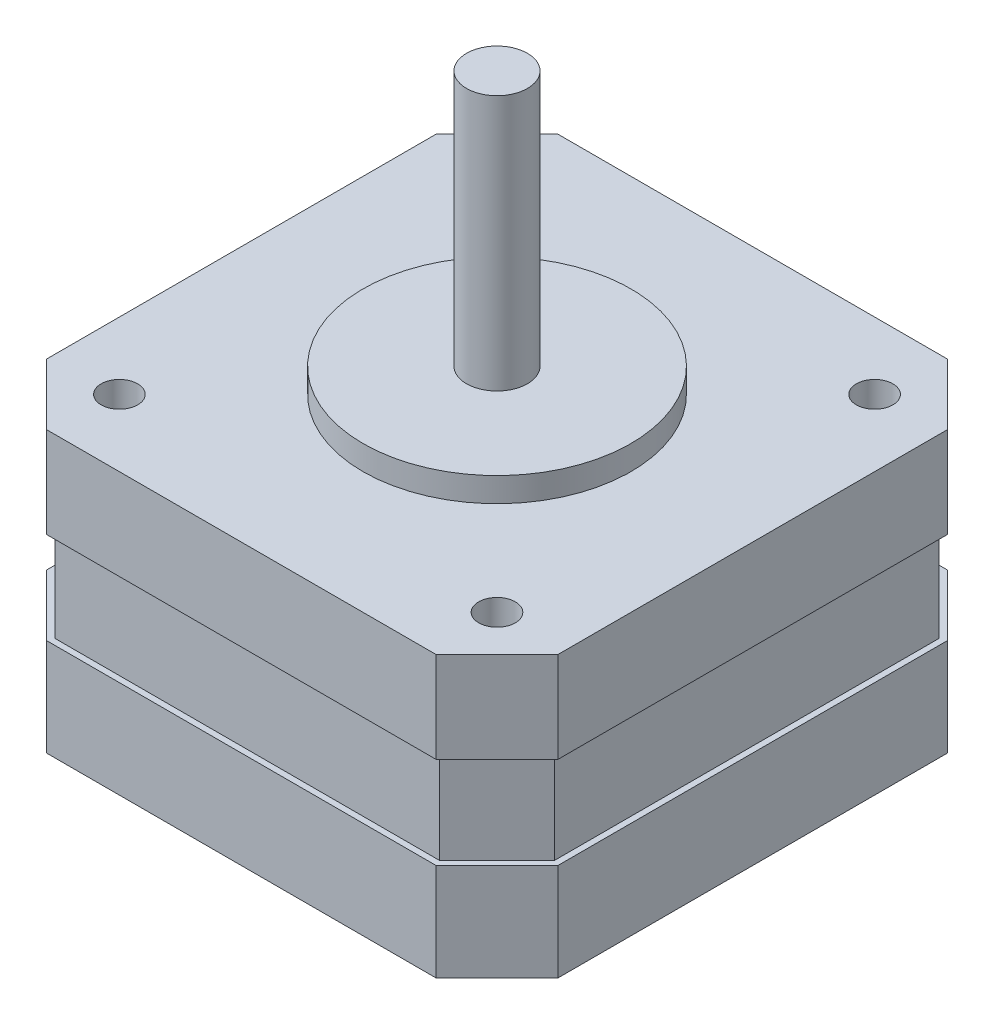
ISO-10303-21;
HEADER;
FILE_DESCRIPTION(('STEP AP214'),'2;1');
FILE_NAME('part.step','',(''),(''),'','','');
FILE_SCHEMA(('AUTOMOTIVE_DESIGN { 1 0 10303 214 1 1 1 1 }'));
ENDSEC;
DATA;
#1=APPLICATION_CONTEXT('core data for automotive mechanical design processes');
#2=APPLICATION_PROTOCOL_DEFINITION('international standard','automotive_design',2000,#1);
#3=PRODUCT_CONTEXT('',#1,'mechanical');
#4=PRODUCT('Part','Part','',(#3));
#5=PRODUCT_RELATED_PRODUCT_CATEGORY('part','',(#4));
#6=PRODUCT_DEFINITION_FORMATION('','',#4);
#7=PRODUCT_DEFINITION_CONTEXT('part definition',#1,'design');
#8=PRODUCT_DEFINITION('design','',#6,#7);
#9=PRODUCT_DEFINITION_SHAPE('','',#8);
#10=(LENGTH_UNIT() NAMED_UNIT(*) SI_UNIT(.MILLI.,.METRE.));
#11=(NAMED_UNIT(*) PLANE_ANGLE_UNIT() SI_UNIT($,.RADIAN.));
#12=(NAMED_UNIT(*) SI_UNIT($,.STERADIAN.) SOLID_ANGLE_UNIT());
#13=UNCERTAINTY_MEASURE_WITH_UNIT(LENGTH_MEASURE(1.E-05),#10,'distance_accuracy_value','');
#14=(GEOMETRIC_REPRESENTATION_CONTEXT(3) GLOBAL_UNCERTAINTY_ASSIGNED_CONTEXT((#13)) GLOBAL_UNIT_ASSIGNED_CONTEXT((#10,
#11,#12)) REPRESENTATION_CONTEXT('',''));
#15=CARTESIAN_POINT('',(0.,0.,0.));
#16=DIRECTION('',(0.,0.,1.));
#17=DIRECTION('',(1.,0.,0.));
#18=AXIS2_PLACEMENT_3D('',#15,#16,#17);
#19=CARTESIAN_POINT('',(16.,-23.,-21.));
#20=DIRECTION('',(-0.707106781186547,0.,0.707106781186548));
#21=DIRECTION('',(0.707106781186548,0.,0.707106781186547));
#22=AXIS2_PLACEMENT_3D('',#19,#20,#21);
#23=PLANE('',#22);
#24=DIRECTION('',(0.,1.,0.));
#25=VECTOR('',#24,1.);
#26=CARTESIAN_POINT('',(21.,-23.,-16.));
#27=LINE('',#26,#25);
#28=CARTESIAN_POINT('',(21.,-7.4567355999271,-16.));
#29=VERTEX_POINT('',#28);
#30=CARTESIAN_POINT('',(21.,0.,-16.));
#31=VERTEX_POINT('',#30);
#32=EDGE_CURVE('E226',#29,#31,#27,.T.);
#33=ORIENTED_EDGE('',*,*,#32,.F.);
#34=DIRECTION('',(0.707106781186549,0.,0.707106781186547));
#35=VECTOR('',#34,1.);
#36=CARTESIAN_POINT('',(21.,-7.4567355999271,-16.));
#37=LINE('',#36,#35);
#38=CARTESIAN_POINT('',(16.,-7.4567355999271,-21.));
#39=VERTEX_POINT('',#38);
#40=EDGE_CURVE('E211',#39,#29,#37,.T.);
#41=ORIENTED_EDGE('',*,*,#40,.F.);
#42=DIRECTION('',(0.,1.,0.));
#43=VECTOR('',#42,1.);
#44=CARTESIAN_POINT('',(16.,-23.,-21.));
#45=LINE('',#44,#43);
#46=CARTESIAN_POINT('',(16.,0.,-21.));
#47=VERTEX_POINT('',#46);
#48=EDGE_CURVE('E225',#39,#47,#45,.T.);
#49=ORIENTED_EDGE('',*,*,#48,.T.);
#50=DIRECTION('',(0.707106781186548,0.,0.707106781186547));
#51=VECTOR('',#50,1.);
#52=CARTESIAN_POINT('',(16.,0.,-21.));
#53=LINE('',#52,#51);
#54=EDGE_CURVE('E394',#47,#31,#53,.T.);
#55=ORIENTED_EDGE('',*,*,#54,.T.);
#56=EDGE_LOOP('',(#33,#41,#49,#55));
#57=FACE_BOUND('',#56,.T.);
#58=ADVANCED_FACE('F39',(#57),#23,.F.);
#59=CARTESIAN_POINT('',(21.,-23.,16.));
#60=DIRECTION('',(1.,0.,0.));
#61=DIRECTION('',(0.,0.,-1.));
#62=AXIS2_PLACEMENT_3D('',#59,#60,#61);
#63=PLANE('',#62);
#64=DIRECTION('',(0.,0.,-1.));
#65=VECTOR('',#64,1.);
#66=CARTESIAN_POINT('',(21.,-15.,-16.));
#67=LINE('',#66,#65);
#68=CARTESIAN_POINT('',(21.,-15.,16.));
#69=VERTEX_POINT('',#68);
#70=CARTESIAN_POINT('',(21.,-15.,-16.));
#71=VERTEX_POINT('',#70);
#72=EDGE_CURVE('E214',#69,#71,#67,.T.);
#73=ORIENTED_EDGE('',*,*,#72,.F.);
#74=DIRECTION('',(0.,1.,0.));
#75=VECTOR('',#74,1.);
#76=CARTESIAN_POINT('',(21.,-23.,16.));
#77=LINE('',#76,#75);
#78=CARTESIAN_POINT('',(21.,-23.,16.));
#79=VERTEX_POINT('',#78);
#80=EDGE_CURVE('E229',#79,#69,#77,.T.);
#81=ORIENTED_EDGE('',*,*,#80,.F.);
#82=DIRECTION('',(0.,0.,-1.));
#83=VECTOR('',#82,1.);
#84=CARTESIAN_POINT('',(21.,-23.,16.));
#85=LINE('',#84,#83);
#86=CARTESIAN_POINT('',(21.,-23.,-16.));
#87=VERTEX_POINT('',#86);
#88=EDGE_CURVE('E224',#79,#87,#85,.T.);
#89=ORIENTED_EDGE('',*,*,#88,.T.);
#90=EDGE_CURVE('E204',#87,#71,#27,.T.);
#91=ORIENTED_EDGE('',*,*,#90,.T.);
#92=EDGE_LOOP('',(#73,#81,#89,#91));
#93=FACE_BOUND('',#92,.T.);
#94=ADVANCED_FACE('F222',(#93),#63,.T.);
#95=CARTESIAN_POINT('',(18.1464466094067,0.,18.1464466094067));
#96=DIRECTION('',(0.707106781186547,0.,0.707106781186548));
#97=DIRECTION('',(0.707106781186548,0.,-0.707106781186547));
#98=AXIS2_PLACEMENT_3D('',#95,#96,#97);
#99=PLANE('',#98);
#100=DIRECTION('',(0.707106781186548,0.,-0.707106781186547));
#101=VECTOR('',#100,1.);
#102=CARTESIAN_POINT('',(20.6464466094067,-15.,15.6464466094067));
#103=LINE('',#102,#101);
#104=CARTESIAN_POINT('',(15.7928932188134,-15.,20.5));
#105=VERTEX_POINT('',#104);
#106=CARTESIAN_POINT('',(20.5,-15.,15.7928932188135));
#107=VERTEX_POINT('',#106);
#108=EDGE_CURVE('E263',#105,#107,#103,.T.);
#109=ORIENTED_EDGE('',*,*,#108,.T.);
#110=DIRECTION('',(0.,1.,0.));
#111=VECTOR('',#110,1.);
#112=CARTESIAN_POINT('',(20.5,0.,15.7928932188135));
#113=LINE('',#112,#111);
#114=CARTESIAN_POINT('',(20.5,-7.4567355999271,15.7928932188135));
#115=VERTEX_POINT('',#114);
#116=EDGE_CURVE('E47',#107,#115,#113,.T.);
#117=ORIENTED_EDGE('',*,*,#116,.T.);
#118=DIRECTION('',(-0.707106781186548,0.,0.707106781186547));
#119=VECTOR('',#118,1.);
#120=CARTESIAN_POINT('',(20.6464466094067,-7.4567355999271,15.6464466094067));
#121=LINE('',#120,#119);
#122=CARTESIAN_POINT('',(15.7928932188134,-7.4567355999271,20.5));
#123=VERTEX_POINT('',#122);
#124=EDGE_CURVE('E261',#115,#123,#121,.T.);
#125=ORIENTED_EDGE('',*,*,#124,.T.);
#126=DIRECTION('',(0.,1.,0.));
#127=VECTOR('',#126,1.);
#128=CARTESIAN_POINT('',(15.7928932188134,0.,20.5));
#129=LINE('',#128,#127);
#130=EDGE_CURVE('E255',#105,#123,#129,.T.);
#131=ORIENTED_EDGE('',*,*,#130,.F.);
#132=EDGE_LOOP('',(#109,#117,#125,#131));
#133=FACE_BOUND('',#132,.T.);
#134=ADVANCED_FACE('F260',(#133),#99,.T.);
#135=CARTESIAN_POINT('',(16.,-23.,21.));
#136=DIRECTION('',(0.707106781186547,0.,0.707106781186548));
#137=DIRECTION('',(0.707106781186548,0.,-0.707106781186547));
#138=AXIS2_PLACEMENT_3D('',#135,#136,#137);
#139=PLANE('',#138);
#140=DIRECTION('',(0.707106781186548,0.,-0.707106781186547));
#141=VECTOR('',#140,1.);
#142=CARTESIAN_POINT('',(21.,-15.,16.));
#143=LINE('',#142,#141);
#144=CARTESIAN_POINT('',(16.,-15.,21.));
#145=VERTEX_POINT('',#144);
#146=EDGE_CURVE('E217',#145,#69,#143,.T.);
#147=ORIENTED_EDGE('',*,*,#146,.F.);
#148=DIRECTION('',(0.,1.,0.));
#149=VECTOR('',#148,1.);
#150=CARTESIAN_POINT('',(16.,-23.,21.));
#151=LINE('',#150,#149);
#152=CARTESIAN_POINT('',(16.,-23.,21.));
#153=VERTEX_POINT('',#152);
#154=EDGE_CURVE('E234',#153,#145,#151,.T.);
#155=ORIENTED_EDGE('',*,*,#154,.F.);
#156=DIRECTION('',(0.707106781186548,0.,-0.707106781186547));
#157=VECTOR('',#156,1.);
#158=CARTESIAN_POINT('',(16.,-23.,21.));
#159=LINE('',#158,#157);
#160=EDGE_CURVE('E371',#153,#79,#159,.T.);
#161=ORIENTED_EDGE('',*,*,#160,.T.);
#162=ORIENTED_EDGE('',*,*,#80,.T.);
#163=EDGE_LOOP('',(#147,#155,#161,#162));
#164=FACE_BOUND('',#163,.T.);
#165=ADVANCED_FACE('F491',(#164),#139,.T.);
#166=CARTESIAN_POINT('',(0.,0.,20.5));
#167=DIRECTION('',(0.,0.,1.));
#168=DIRECTION('',(1.,0.,0.));
#169=AXIS2_PLACEMENT_3D('',#166,#167,#168);
#170=PLANE('',#169);
#171=DIRECTION('',(1.,0.,0.));
#172=VECTOR('',#171,1.);
#173=CARTESIAN_POINT('',(16.,-15.,20.5));
#174=LINE('',#173,#172);
#175=CARTESIAN_POINT('',(-15.7928932188135,-15.,20.5));
#176=VERTEX_POINT('',#175);
#177=EDGE_CURVE('E281',#176,#105,#174,.T.);
#178=ORIENTED_EDGE('',*,*,#177,.T.);
#179=ORIENTED_EDGE('',*,*,#130,.T.);
#180=DIRECTION('',(-1.,0.,0.));
#181=VECTOR('',#180,1.);
#182=CARTESIAN_POINT('',(16.,-7.4567355999271,20.5));
#183=LINE('',#182,#181);
#184=CARTESIAN_POINT('',(-15.7928932188135,-7.4567355999271,20.5));
#185=VERTEX_POINT('',#184);
#186=EDGE_CURVE('E270',#123,#185,#183,.T.);
#187=ORIENTED_EDGE('',*,*,#186,.T.);
#188=DIRECTION('',(0.,1.,0.));
#189=VECTOR('',#188,1.);
#190=CARTESIAN_POINT('',(-15.7928932188135,0.,20.5));
#191=LINE('',#190,#189);
#192=EDGE_CURVE('E252',#176,#185,#191,.T.);
#193=ORIENTED_EDGE('',*,*,#192,.F.);
#194=EDGE_LOOP('',(#178,#179,#187,#193));
#195=FACE_BOUND('',#194,.T.);
#196=ADVANCED_FACE('F488',(#195),#170,.T.);
#197=CARTESIAN_POINT('',(-16.,-23.,21.));
#198=DIRECTION('',(0.,0.,1.));
#199=DIRECTION('',(1.,0.,0.));
#200=AXIS2_PLACEMENT_3D('',#197,#198,#199);
#201=PLANE('',#200);
#202=DIRECTION('',(1.,0.,0.));
#203=VECTOR('',#202,1.);
#204=CARTESIAN_POINT('',(16.,-15.,21.));
#205=LINE('',#204,#203);
#206=CARTESIAN_POINT('',(-16.,-15.,21.));
#207=VERTEX_POINT('',#206);
#208=EDGE_CURVE('E282',#207,#145,#205,.T.);
#209=ORIENTED_EDGE('',*,*,#208,.F.);
#210=DIRECTION('',(0.,1.,0.));
#211=VECTOR('',#210,1.);
#212=CARTESIAN_POINT('',(-16.,-23.,21.));
#213=LINE('',#212,#211);
#214=CARTESIAN_POINT('',(-16.,-23.,21.));
#215=VERTEX_POINT('',#214);
#216=EDGE_CURVE('E238',#215,#207,#213,.T.);
#217=ORIENTED_EDGE('',*,*,#216,.F.);
#218=DIRECTION('',(1.,0.,0.));
#219=VECTOR('',#218,1.);
#220=CARTESIAN_POINT('',(-16.,-23.,21.));
#221=LINE('',#220,#219);
#222=EDGE_CURVE('E367',#215,#153,#221,.T.);
#223=ORIENTED_EDGE('',*,*,#222,.T.);
#224=ORIENTED_EDGE('',*,*,#154,.T.);
#225=EDGE_LOOP('',(#209,#217,#223,#224));
#226=FACE_BOUND('',#225,.T.);
#227=ADVANCED_FACE('F490',(#226),#201,.T.);
#228=CARTESIAN_POINT('',(-18.1464466094067,0.,18.1464466094067));
#229=DIRECTION('',(-0.707106781186548,0.,0.707106781186547));
#230=DIRECTION('',(0.707106781186547,0.,0.707106781186548));
#231=AXIS2_PLACEMENT_3D('',#228,#229,#230);
#232=PLANE('',#231);
#233=DIRECTION('',(0.707106781186547,0.,0.707106781186548));
#234=VECTOR('',#233,1.);
#235=CARTESIAN_POINT('',(-15.6464466094067,-15.,20.6464466094067));
#236=LINE('',#235,#234);
#237=CARTESIAN_POINT('',(-20.5,-15.,15.7928932188135));
#238=VERTEX_POINT('',#237);
#239=EDGE_CURVE('E290',#238,#176,#236,.T.);
#240=ORIENTED_EDGE('',*,*,#239,.T.);
#241=ORIENTED_EDGE('',*,*,#192,.T.);
#242=DIRECTION('',(-0.707106781186547,0.,-0.707106781186548));
#243=VECTOR('',#242,1.);
#244=CARTESIAN_POINT('',(-15.6464466094067,-7.4567355999271,20.6464466094067));
#245=LINE('',#244,#243);
#246=CARTESIAN_POINT('',(-20.5,-7.4567355999271,15.7928932188135));
#247=VERTEX_POINT('',#246);
#248=EDGE_CURVE('E288',#185,#247,#245,.T.);
#249=ORIENTED_EDGE('',*,*,#248,.T.);
#250=DIRECTION('',(0.,1.,0.));
#251=VECTOR('',#250,1.);
#252=CARTESIAN_POINT('',(-20.5,0.,15.7928932188135));
#253=LINE('',#252,#251);
#254=EDGE_CURVE('E249',#238,#247,#253,.T.);
#255=ORIENTED_EDGE('',*,*,#254,.F.);
#256=EDGE_LOOP('',(#240,#241,#249,#255));
#257=FACE_BOUND('',#256,.T.);
#258=ADVANCED_FACE('F485',(#257),#232,.T.);
#259=CARTESIAN_POINT('',(-21.,-23.,16.));
#260=DIRECTION('',(-0.707106781186547,0.,0.707106781186547));
#261=DIRECTION('',(0.707106781186548,0.,0.707106781186548));
#262=AXIS2_PLACEMENT_3D('',#259,#260,#261);
#263=PLANE('',#262);
#264=DIRECTION('',(0.707106781186547,0.,0.707106781186548));
#265=VECTOR('',#264,1.);
#266=CARTESIAN_POINT('',(-16.,-15.,21.));
#267=LINE('',#266,#265);
#268=CARTESIAN_POINT('',(-21.,-15.,16.));
#269=VERTEX_POINT('',#268);
#270=EDGE_CURVE('E291',#269,#207,#267,.T.);
#271=ORIENTED_EDGE('',*,*,#270,.F.);
#272=DIRECTION('',(0.,1.,0.));
#273=VECTOR('',#272,1.);
#274=CARTESIAN_POINT('',(-21.,-23.,16.));
#275=LINE('',#274,#273);
#276=CARTESIAN_POINT('',(-21.,-23.,16.));
#277=VERTEX_POINT('',#276);
#278=EDGE_CURVE('E246',#277,#269,#275,.T.);
#279=ORIENTED_EDGE('',*,*,#278,.F.);
#280=DIRECTION('',(0.707106781186548,0.,0.707106781186548));
#281=VECTOR('',#280,1.);
#282=CARTESIAN_POINT('',(-21.,-23.,16.));
#283=LINE('',#282,#281);
#284=EDGE_CURVE('E364',#277,#215,#283,.T.);
#285=ORIENTED_EDGE('',*,*,#284,.T.);
#286=ORIENTED_EDGE('',*,*,#216,.T.);
#287=EDGE_LOOP('',(#271,#279,#285,#286));
#288=FACE_BOUND('',#287,.T.);
#289=ADVANCED_FACE('F597',(#288),#263,.T.);
#290=CARTESIAN_POINT('',(-20.5,0.,0.));
#291=DIRECTION('',(-1.,0.,0.));
#292=DIRECTION('',(0.,0.,1.));
#293=AXIS2_PLACEMENT_3D('',#290,#291,#292);
#294=PLANE('',#293);
#295=DIRECTION('',(0.,0.,1.));
#296=VECTOR('',#295,1.);
#297=CARTESIAN_POINT('',(-20.5,-15.,16.));
#298=LINE('',#297,#296);
#299=CARTESIAN_POINT('',(-20.5,-15.,-15.7928932188135));
#300=VERTEX_POINT('',#299);
#301=EDGE_CURVE('E300',#300,#238,#298,.T.);
#302=ORIENTED_EDGE('',*,*,#301,.T.);
#303=ORIENTED_EDGE('',*,*,#254,.T.);
#304=DIRECTION('',(0.,0.,-1.));
#305=VECTOR('',#304,1.);
#306=CARTESIAN_POINT('',(-20.5,-7.4567355999271,16.));
#307=LINE('',#306,#305);
#308=CARTESIAN_POINT('',(-20.5,-7.4567355999271,-15.7928932188135));
#309=VERTEX_POINT('',#308);
#310=EDGE_CURVE('E298',#247,#309,#307,.T.);
#311=ORIENTED_EDGE('',*,*,#310,.T.);
#312=DIRECTION('',(0.,1.,0.));
#313=VECTOR('',#312,1.);
#314=CARTESIAN_POINT('',(-20.5,0.,-15.7928932188135));
#315=LINE('',#314,#313);
#316=EDGE_CURVE('E245',#300,#309,#315,.T.);
#317=ORIENTED_EDGE('',*,*,#316,.F.);
#318=EDGE_LOOP('',(#302,#303,#311,#317));
#319=FACE_BOUND('',#318,.T.);
#320=ADVANCED_FACE('F483',(#319),#294,.T.);
#321=CARTESIAN_POINT('',(-21.,-23.,16.));
#322=DIRECTION('',(1.,0.,0.));
#323=DIRECTION('',(0.,0.,-1.));
#324=AXIS2_PLACEMENT_3D('',#321,#322,#323);
#325=PLANE('',#324);
#326=ORIENTED_EDGE('',*,*,#278,.T.);
#327=DIRECTION('',(0.,0.,1.));
#328=VECTOR('',#327,1.);
#329=CARTESIAN_POINT('',(-21.,-15.,16.));
#330=LINE('',#329,#328);
#331=CARTESIAN_POINT('',(-21.,-15.,-16.));
#332=VERTEX_POINT('',#331);
#333=EDGE_CURVE('E301',#332,#269,#330,.T.);
#334=ORIENTED_EDGE('',*,*,#333,.F.);
#335=DIRECTION('',(0.,1.,0.));
#336=VECTOR('',#335,1.);
#337=CARTESIAN_POINT('',(-21.,-23.,-16.));
#338=LINE('',#337,#336);
#339=CARTESIAN_POINT('',(-21.,-23.,-16.));
#340=VERTEX_POINT('',#339);
#341=EDGE_CURVE('E408',#340,#332,#338,.T.);
#342=ORIENTED_EDGE('',*,*,#341,.F.);
#343=DIRECTION('',(0.,0.,-1.));
#344=VECTOR('',#343,1.);
#345=CARTESIAN_POINT('',(-21.,-23.,16.));
#346=LINE('',#345,#344);
#347=EDGE_CURVE('E381',#277,#340,#346,.T.);
#348=ORIENTED_EDGE('',*,*,#347,.F.);
#349=EDGE_LOOP('',(#326,#334,#342,#348));
#350=FACE_BOUND('',#349,.T.);
#351=ADVANCED_FACE('F593',(#350),#325,.F.);
#352=CARTESIAN_POINT('',(-18.1464466094068,0.,-18.1464466094067));
#353=DIRECTION('',(-0.707106781186549,0.,-0.707106781186546));
#354=DIRECTION('',(-0.707106781186546,0.,0.707106781186549));
#355=AXIS2_PLACEMENT_3D('',#352,#353,#354);
#356=PLANE('',#355);
#357=DIRECTION('',(-0.707106781186546,0.,0.707106781186549));
#358=VECTOR('',#357,1.);
#359=CARTESIAN_POINT('',(-20.6464466094067,-15.,-15.6464466094067));
#360=LINE('',#359,#358);
#361=CARTESIAN_POINT('',(-15.7928932188135,-15.,-20.5));
#362=VERTEX_POINT('',#361);
#363=EDGE_CURVE('E310',#362,#300,#360,.T.);
#364=ORIENTED_EDGE('',*,*,#363,.T.);
#365=ORIENTED_EDGE('',*,*,#316,.T.);
#366=DIRECTION('',(0.707106781186546,0.,-0.707106781186549));
#367=VECTOR('',#366,1.);
#368=CARTESIAN_POINT('',(-20.6464466094067,-7.4567355999271,-15.6464466094067));
#369=LINE('',#368,#367);
#370=CARTESIAN_POINT('',(-15.7928932188135,-7.4567355999271,-20.5));
#371=VERTEX_POINT('',#370);
#372=EDGE_CURVE('E308',#309,#371,#369,.T.);
#373=ORIENTED_EDGE('',*,*,#372,.T.);
#374=DIRECTION('',(0.,1.,0.));
#375=VECTOR('',#374,1.);
#376=CARTESIAN_POINT('',(-15.7928932188135,0.,-20.5));
#377=LINE('',#376,#375);
#378=EDGE_CURVE('E242',#362,#371,#377,.T.);
#379=ORIENTED_EDGE('',*,*,#378,.F.);
#380=EDGE_LOOP('',(#364,#365,#373,#379));
#381=FACE_BOUND('',#380,.T.);
#382=ADVANCED_FACE('F479',(#381),#356,.T.);
#383=CARTESIAN_POINT('',(-21.,-23.,-16.));
#384=DIRECTION('',(0.707106781186549,0.,0.707106781186546));
#385=DIRECTION('',(0.707106781186546,0.,-0.707106781186549));
#386=AXIS2_PLACEMENT_3D('',#383,#384,#385);
#387=PLANE('',#386);
#388=ORIENTED_EDGE('',*,*,#341,.T.);
#389=DIRECTION('',(-0.707106781186546,0.,0.707106781186549));
#390=VECTOR('',#389,1.);
#391=CARTESIAN_POINT('',(-21.,-15.,-16.));
#392=LINE('',#391,#390);
#393=CARTESIAN_POINT('',(-16.,-15.,-21.));
#394=VERTEX_POINT('',#393);
#395=EDGE_CURVE('E311',#394,#332,#392,.T.);
#396=ORIENTED_EDGE('',*,*,#395,.F.);
#397=DIRECTION('',(0.,1.,0.));
#398=VECTOR('',#397,1.);
#399=CARTESIAN_POINT('',(-16.,-23.,-21.));
#400=LINE('',#399,#398);
#401=CARTESIAN_POINT('',(-16.,-23.,-21.));
#402=VERTEX_POINT('',#401);
#403=EDGE_CURVE('E411',#402,#394,#400,.T.);
#404=ORIENTED_EDGE('',*,*,#403,.F.);
#405=DIRECTION('',(0.707106781186546,0.,-0.707106781186549));
#406=VECTOR('',#405,1.);
#407=CARTESIAN_POINT('',(-21.,-23.,-16.));
#408=LINE('',#407,#406);
#409=EDGE_CURVE('E379',#340,#402,#408,.T.);
#410=ORIENTED_EDGE('',*,*,#409,.F.);
#411=EDGE_LOOP('',(#388,#396,#404,#410));
#412=FACE_BOUND('',#411,.T.);
#413=ADVANCED_FACE('F519',(#412),#387,.F.);
#414=CARTESIAN_POINT('',(0.,0.,-20.5));
#415=DIRECTION('',(0.,0.,-1.));
#416=DIRECTION('',(-1.,0.,0.));
#417=AXIS2_PLACEMENT_3D('',#414,#415,#416);
#418=PLANE('',#417);
#419=DIRECTION('',(0.,1.,0.));
#420=VECTOR('',#419,1.);
#421=CARTESIAN_POINT('',(15.7928932188135,0.,-20.5));
#422=LINE('',#421,#420);
#423=CARTESIAN_POINT('',(15.7928932188135,-15.,-20.5));
#424=VERTEX_POINT('',#423);
#425=CARTESIAN_POINT('',(15.7928932188135,-7.4567355999271,-20.5));
#426=VERTEX_POINT('',#425);
#427=EDGE_CURVE('E460',#424,#426,#422,.T.);
#428=ORIENTED_EDGE('',*,*,#427,.F.);
#429=DIRECTION('',(-1.,0.,0.));
#430=VECTOR('',#429,1.);
#431=CARTESIAN_POINT('',(16.,-15.,-20.5));
#432=LINE('',#431,#430);
#433=EDGE_CURVE('E318',#424,#362,#432,.T.);
#434=ORIENTED_EDGE('',*,*,#433,.T.);
#435=ORIENTED_EDGE('',*,*,#378,.T.);
#436=DIRECTION('',(1.,0.,0.));
#437=VECTOR('',#436,1.);
#438=CARTESIAN_POINT('',(16.,-7.4567355999271,-20.5));
#439=LINE('',#438,#437);
#440=EDGE_CURVE('E320',#371,#426,#439,.T.);
#441=ORIENTED_EDGE('',*,*,#440,.T.);
#442=EDGE_LOOP('',(#428,#434,#435,#441));
#443=FACE_BOUND('',#442,.T.);
#444=ADVANCED_FACE('F472',(#443),#418,.T.);
#445=CARTESIAN_POINT('',(-16.,-23.,-21.));
#446=DIRECTION('',(0.,0.,1.));
#447=DIRECTION('',(1.,0.,0.));
#448=AXIS2_PLACEMENT_3D('',#445,#446,#447);
#449=PLANE('',#448);
#450=ORIENTED_EDGE('',*,*,#48,.F.);
#451=DIRECTION('',(1.,0.,0.));
#452=VECTOR('',#451,1.);
#453=CARTESIAN_POINT('',(16.,-7.4567355999271,-21.));
#454=LINE('',#453,#452);
#455=CARTESIAN_POINT('',(-16.,-7.4567355999271,-21.));
#456=VERTEX_POINT('',#455);
#457=EDGE_CURVE('E321',#456,#39,#454,.T.);
#458=ORIENTED_EDGE('',*,*,#457,.F.);
#459=CARTESIAN_POINT('',(-16.,0.,-21.));
#460=VERTEX_POINT('',#459);
#461=EDGE_CURVE('E413',#456,#460,#400,.T.);
#462=ORIENTED_EDGE('',*,*,#461,.T.);
#463=DIRECTION('',(1.,0.,0.));
#464=VECTOR('',#463,1.);
#465=CARTESIAN_POINT('',(-16.,0.,-21.));
#466=LINE('',#465,#464);
#467=EDGE_CURVE('E397',#460,#47,#466,.T.);
#468=ORIENTED_EDGE('',*,*,#467,.T.);
#469=EDGE_LOOP('',(#450,#458,#462,#468));
#470=FACE_BOUND('',#469,.T.);
#471=ADVANCED_FACE('F421',(#470),#449,.F.);
#472=CARTESIAN_POINT('',(0.,0.,0.));
#473=DIRECTION('',(0.,1.,0.));
#474=DIRECTION('',(0.,0.,1.));
#475=AXIS2_PLACEMENT_3D('',#472,#473,#474);
#476=PLANE('',#475);
#477=CARTESIAN_POINT('',(15.5,0.,15.5));
#478=DIRECTION('',(0.,1.,0.));
#479=DIRECTION('',(0.,0.,1.));
#480=AXIS2_PLACEMENT_3D('',#477,#478,#479);
#481=CIRCLE('',#480,1.5);
#482=CARTESIAN_POINT('',(15.5,0.,17.));
#483=VERTEX_POINT('',#482);
#484=EDGE_CURVE('E324',#483,#483,#481,.T.);
#485=ORIENTED_EDGE('',*,*,#484,.F.);
#486=EDGE_LOOP('',(#485));
#487=FACE_BOUND('',#486,.T.);
#488=CARTESIAN_POINT('',(15.5,0.,-15.5));
#489=DIRECTION('',(0.,1.,0.));
#490=DIRECTION('',(0.,0.,1.));
#491=AXIS2_PLACEMENT_3D('',#488,#489,#490);
#492=CIRCLE('',#491,1.5);
#493=CARTESIAN_POINT('',(15.5,0.,-14.));
#494=VERTEX_POINT('',#493);
#495=EDGE_CURVE('E331',#494,#494,#492,.T.);
#496=ORIENTED_EDGE('',*,*,#495,.F.);
#497=EDGE_LOOP('',(#496));
#498=FACE_BOUND('',#497,.T.);
#499=CARTESIAN_POINT('',(-15.5,0.,-15.5));
#500=DIRECTION('',(0.,1.,0.));
#501=DIRECTION('',(0.,0.,1.));
#502=AXIS2_PLACEMENT_3D('',#499,#500,#501);
#503=CIRCLE('',#502,1.5);
#504=CARTESIAN_POINT('',(-15.5,0.,-14.));
#505=VERTEX_POINT('',#504);
#506=EDGE_CURVE('E337',#505,#505,#503,.T.);
#507=ORIENTED_EDGE('',*,*,#506,.F.);
#508=EDGE_LOOP('',(#507));
#509=FACE_BOUND('',#508,.T.);
#510=CARTESIAN_POINT('',(-15.5,0.,15.5));
#511=DIRECTION('',(0.,1.,0.));
#512=DIRECTION('',(0.,0.,1.));
#513=AXIS2_PLACEMENT_3D('',#510,#511,#512);
#514=CIRCLE('',#513,1.5);
#515=CARTESIAN_POINT('',(-15.5,0.,17.));
#516=VERTEX_POINT('',#515);
#517=EDGE_CURVE('E343',#516,#516,#514,.T.);
#518=ORIENTED_EDGE('',*,*,#517,.F.);
#519=EDGE_LOOP('',(#518));
#520=FACE_BOUND('',#519,.T.);
#521=DIRECTION('',(0.707106781186548,0.,0.707106781186548));
#522=VECTOR('',#521,1.);
#523=CARTESIAN_POINT('',(-21.,0.,16.));
#524=LINE('',#523,#522);
#525=CARTESIAN_POINT('',(-21.,0.,16.));
#526=VERTEX_POINT('',#525);
#527=CARTESIAN_POINT('',(-16.,0.,21.));
#528=VERTEX_POINT('',#527);
#529=EDGE_CURVE('E363',#526,#528,#524,.T.);
#530=ORIENTED_EDGE('',*,*,#529,.T.);
#531=DIRECTION('',(1.,0.,0.));
#532=VECTOR('',#531,1.);
#533=CARTESIAN_POINT('',(-16.,0.,21.));
#534=LINE('',#533,#532);
#535=CARTESIAN_POINT('',(16.,0.,21.));
#536=VERTEX_POINT('',#535);
#537=EDGE_CURVE('E385',#528,#536,#534,.T.);
#538=ORIENTED_EDGE('',*,*,#537,.T.);
#539=DIRECTION('',(0.707106781186548,0.,-0.707106781186547));
#540=VECTOR('',#539,1.);
#541=CARTESIAN_POINT('',(16.,0.,21.));
#542=LINE('',#541,#540);
#543=CARTESIAN_POINT('',(21.,0.,16.));
#544=VERTEX_POINT('',#543);
#545=EDGE_CURVE('E388',#536,#544,#542,.T.);
#546=ORIENTED_EDGE('',*,*,#545,.T.);
#547=DIRECTION('',(0.,0.,-1.));
#548=VECTOR('',#547,1.);
#549=CARTESIAN_POINT('',(21.,0.,16.));
#550=LINE('',#549,#548);
#551=EDGE_CURVE('E391',#544,#31,#550,.T.);
#552=ORIENTED_EDGE('',*,*,#551,.T.);
#553=ORIENTED_EDGE('',*,*,#54,.F.);
#554=ORIENTED_EDGE('',*,*,#467,.F.);
#555=DIRECTION('',(0.707106781186546,0.,-0.707106781186549));
#556=VECTOR('',#555,1.);
#557=CARTESIAN_POINT('',(-21.,0.,-16.));
#558=LINE('',#557,#556);
#559=CARTESIAN_POINT('',(-21.,0.,-16.));
#560=VERTEX_POINT('',#559);
#561=EDGE_CURVE('E400',#560,#460,#558,.T.);
#562=ORIENTED_EDGE('',*,*,#561,.F.);
#563=DIRECTION('',(0.,0.,-1.));
#564=VECTOR('',#563,1.);
#565=CARTESIAN_POINT('',(-21.,0.,16.));
#566=LINE('',#565,#564);
#567=EDGE_CURVE('E368',#526,#560,#566,.T.);
#568=ORIENTED_EDGE('',*,*,#567,.F.);
#569=EDGE_LOOP('',(#530,#538,#546,#552,#553,#554,#562,#568));
#570=FACE_BOUND('',#569,.T.);
#571=CARTESIAN_POINT('',(0.,0.,0.));
#572=DIRECTION('',(0.,1.,0.));
#573=DIRECTION('',(0.,0.,1.));
#574=AXIS2_PLACEMENT_3D('',#571,#572,#573);
#575=CIRCLE('',#574,11.);
#576=CARTESIAN_POINT('',(0.,0.,11.));
#577=VERTEX_POINT('',#576);
#578=EDGE_CURVE('E349',#577,#577,#575,.T.);
#579=ORIENTED_EDGE('',*,*,#578,.F.);
#580=EDGE_LOOP('',(#579));
#581=FACE_BOUND('',#580,.T.);
#582=ADVANCED_FACE('F431',(#487,#498,#509,#520,#570,#581),#476,.T.);
#583=DIRECTION('',(-0.707106781186547,0.,-0.707106781186548));
#584=VECTOR('',#583,1.);
#585=CARTESIAN_POINT('',(-16.,-7.4567355999271,21.));
#586=LINE('',#585,#584);
#587=CARTESIAN_POINT('',(-16.,-7.4567355999271,21.));
#588=VERTEX_POINT('',#587);
#589=CARTESIAN_POINT('',(-21.,-7.4567355999271,16.));
#590=VERTEX_POINT('',#589);
#591=EDGE_CURVE('E285',#588,#590,#586,.T.);
#592=ORIENTED_EDGE('',*,*,#591,.F.);
#593=EDGE_CURVE('E241',#588,#528,#213,.T.);
#594=ORIENTED_EDGE('',*,*,#593,.T.);
#595=ORIENTED_EDGE('',*,*,#529,.F.);
#596=EDGE_CURVE('E407',#590,#526,#275,.T.);
#597=ORIENTED_EDGE('',*,*,#596,.F.);
#598=EDGE_LOOP('',(#592,#594,#595,#597));
#599=FACE_BOUND('',#598,.T.);
#600=ADVANCED_FACE('F41',(#599),#263,.T.);
#601=CARTESIAN_POINT('',(-21.,-7.4567355999271,-16.));
#602=VERTEX_POINT('',#601);
#603=EDGE_CURVE('E410',#602,#560,#338,.T.);
#604=ORIENTED_EDGE('',*,*,#603,.F.);
#605=DIRECTION('',(0.,0.,-1.));
#606=VECTOR('',#605,1.);
#607=CARTESIAN_POINT('',(-21.,-7.4567355999271,16.));
#608=LINE('',#607,#606);
#609=EDGE_CURVE('E294',#590,#602,#608,.T.);
#610=ORIENTED_EDGE('',*,*,#609,.F.);
#611=ORIENTED_EDGE('',*,*,#596,.T.);
#612=ORIENTED_EDGE('',*,*,#567,.T.);
#613=EDGE_LOOP('',(#604,#610,#611,#612));
#614=FACE_BOUND('',#613,.T.);
#615=ADVANCED_FACE('F442',(#614),#325,.F.);
#616=ORIENTED_EDGE('',*,*,#461,.F.);
#617=DIRECTION('',(0.707106781186546,0.,-0.707106781186549));
#618=VECTOR('',#617,1.);
#619=CARTESIAN_POINT('',(-21.,-7.4567355999271,-16.));
#620=LINE('',#619,#618);
#621=EDGE_CURVE('E304',#602,#456,#620,.T.);
#622=ORIENTED_EDGE('',*,*,#621,.F.);
#623=ORIENTED_EDGE('',*,*,#603,.T.);
#624=ORIENTED_EDGE('',*,*,#561,.T.);
#625=EDGE_LOOP('',(#616,#622,#623,#624));
#626=FACE_BOUND('',#625,.T.);
#627=ADVANCED_FACE('F427',(#626),#387,.F.);
#628=ORIENTED_EDGE('',*,*,#403,.T.);
#629=DIRECTION('',(-1.,0.,0.));
#630=VECTOR('',#629,1.);
#631=CARTESIAN_POINT('',(16.,-15.,-21.));
#632=LINE('',#631,#630);
#633=CARTESIAN_POINT('',(16.,-15.,-21.));
#634=VERTEX_POINT('',#633);
#635=EDGE_CURVE('E314',#634,#394,#632,.T.);
#636=ORIENTED_EDGE('',*,*,#635,.F.);
#637=CARTESIAN_POINT('',(16.,-23.,-21.));
#638=VERTEX_POINT('',#637);
#639=EDGE_CURVE('E207',#638,#634,#45,.T.);
#640=ORIENTED_EDGE('',*,*,#639,.F.);
#641=DIRECTION('',(1.,0.,0.));
#642=VECTOR('',#641,1.);
#643=CARTESIAN_POINT('',(-16.,-23.,-21.));
#644=LINE('',#643,#642);
#645=EDGE_CURVE('E377',#402,#638,#644,.T.);
#646=ORIENTED_EDGE('',*,*,#645,.F.);
#647=EDGE_LOOP('',(#628,#636,#640,#646));
#648=FACE_BOUND('',#647,.T.);
#649=ADVANCED_FACE('F510',(#648),#449,.F.);
#650=ORIENTED_EDGE('',*,*,#639,.T.);
#651=DIRECTION('',(-0.707106781186549,0.,-0.707106781186547));
#652=VECTOR('',#651,1.);
#653=CARTESIAN_POINT('',(21.,-15.,-16.));
#654=LINE('',#653,#652);
#655=EDGE_CURVE('E199',#71,#634,#654,.T.);
#656=ORIENTED_EDGE('',*,*,#655,.F.);
#657=ORIENTED_EDGE('',*,*,#90,.F.);
#658=DIRECTION('',(0.707106781186548,0.,0.707106781186547));
#659=VECTOR('',#658,1.);
#660=CARTESIAN_POINT('',(16.,-23.,-21.));
#661=LINE('',#660,#659);
#662=EDGE_CURVE('E375',#638,#87,#661,.T.);
#663=ORIENTED_EDGE('',*,*,#662,.F.);
#664=EDGE_LOOP('',(#650,#656,#657,#663));
#665=FACE_BOUND('',#664,.T.);
#666=ADVANCED_FACE('F201',(#665),#23,.F.);
#667=DIRECTION('',(0.,0.,1.));
#668=VECTOR('',#667,1.);
#669=CARTESIAN_POINT('',(21.,-7.4567355999271,-16.));
#670=LINE('',#669,#668);
#671=CARTESIAN_POINT('',(21.,-7.4567355999271,16.));
#672=VERTEX_POINT('',#671);
#673=EDGE_CURVE('E220',#29,#672,#670,.T.);
#674=ORIENTED_EDGE('',*,*,#673,.F.);
#675=ORIENTED_EDGE('',*,*,#32,.T.);
#676=ORIENTED_EDGE('',*,*,#551,.F.);
#677=EDGE_CURVE('E233',#672,#544,#77,.T.);
#678=ORIENTED_EDGE('',*,*,#677,.F.);
#679=EDGE_LOOP('',(#674,#675,#676,#678));
#680=FACE_BOUND('',#679,.T.);
#681=ADVANCED_FACE('F459',(#680),#63,.T.);
#682=DIRECTION('',(-0.707106781186548,0.,0.707106781186547));
#683=VECTOR('',#682,1.);
#684=CARTESIAN_POINT('',(21.,-7.4567355999271,16.));
#685=LINE('',#684,#683);
#686=CARTESIAN_POINT('',(16.,-7.4567355999271,21.));
#687=VERTEX_POINT('',#686);
#688=EDGE_CURVE('E274',#672,#687,#685,.T.);
#689=ORIENTED_EDGE('',*,*,#688,.F.);
#690=ORIENTED_EDGE('',*,*,#677,.T.);
#691=ORIENTED_EDGE('',*,*,#545,.F.);
#692=EDGE_CURVE('E237',#687,#536,#151,.T.);
#693=ORIENTED_EDGE('',*,*,#692,.F.);
#694=EDGE_LOOP('',(#689,#690,#691,#693));
#695=FACE_BOUND('',#694,.T.);
#696=ADVANCED_FACE('F456',(#695),#139,.T.);
#697=DIRECTION('',(-1.,0.,0.));
#698=VECTOR('',#697,1.);
#699=CARTESIAN_POINT('',(16.,-7.4567355999271,21.));
#700=LINE('',#699,#698);
#701=EDGE_CURVE('E272',#687,#588,#700,.T.);
#702=ORIENTED_EDGE('',*,*,#701,.F.);
#703=ORIENTED_EDGE('',*,*,#692,.T.);
#704=ORIENTED_EDGE('',*,*,#537,.F.);
#705=ORIENTED_EDGE('',*,*,#593,.F.);
#706=EDGE_LOOP('',(#702,#703,#704,#705));
#707=FACE_BOUND('',#706,.T.);
#708=ADVANCED_FACE('F451',(#707),#201,.T.);
#709=CARTESIAN_POINT('',(0.,-23.,0.));
#710=DIRECTION('',(0.,1.,0.));
#711=DIRECTION('',(0.,0.,1.));
#712=AXIS2_PLACEMENT_3D('',#709,#710,#711);
#713=PLANE('',#712);
#714=ORIENTED_EDGE('',*,*,#284,.F.);
#715=ORIENTED_EDGE('',*,*,#347,.T.);
#716=ORIENTED_EDGE('',*,*,#409,.T.);
#717=ORIENTED_EDGE('',*,*,#645,.T.);
#718=ORIENTED_EDGE('',*,*,#662,.T.);
#719=ORIENTED_EDGE('',*,*,#88,.F.);
#720=ORIENTED_EDGE('',*,*,#160,.F.);
#721=ORIENTED_EDGE('',*,*,#222,.F.);
#722=EDGE_LOOP('',(#714,#715,#716,#717,#718,#719,#720,#721));
#723=FACE_BOUND('',#722,.T.);
#724=ADVANCED_FACE('F581',(#723),#713,.F.);
#725=CARTESIAN_POINT('',(0.,2.,0.));
#726=DIRECTION('',(0.,-1.,0.));
#727=DIRECTION('',(0.,0.,-1.));
#728=AXIS2_PLACEMENT_3D('',#725,#726,#727);
#729=CYLINDRICAL_SURFACE('',#728,11.);
#730=CARTESIAN_POINT('',(0.,2.,0.));
#731=DIRECTION('',(0.,1.,0.));
#732=DIRECTION('',(0.,0.,1.));
#733=AXIS2_PLACEMENT_3D('',#730,#731,#732);
#734=CIRCLE('',#733,11.);
#735=CARTESIAN_POINT('',(0.,2.,11.));
#736=VERTEX_POINT('',#735);
#737=EDGE_CURVE('E355',#736,#736,#734,.T.);
#738=ORIENTED_EDGE('',*,*,#737,.F.);
#739=EDGE_LOOP('',(#738));
#740=FACE_BOUND('',#739,.T.);
#741=ORIENTED_EDGE('',*,*,#578,.T.);
#742=EDGE_LOOP('',(#741));
#743=FACE_BOUND('',#742,.T.);
#744=ADVANCED_FACE('F577',(#740,#743),#729,.T.);
#745=CARTESIAN_POINT('',(0.,2.,0.));
#746=DIRECTION('',(0.,1.,0.));
#747=DIRECTION('',(0.,0.,1.));
#748=AXIS2_PLACEMENT_3D('',#745,#746,#747);
#749=PLANE('',#748);
#750=CARTESIAN_POINT('',(0.,2.,0.));
#751=DIRECTION('',(0.,1.,0.));
#752=DIRECTION('',(0.,0.,1.));
#753=AXIS2_PLACEMENT_3D('',#750,#751,#752);
#754=CIRCLE('',#753,2.5);
#755=CARTESIAN_POINT('',(0.,2.,2.50000000000001));
#756=VERTEX_POINT('',#755);
#757=EDGE_CURVE('E352',#756,#756,#754,.T.);
#758=ORIENTED_EDGE('',*,*,#757,.F.);
#759=EDGE_LOOP('',(#758));
#760=FACE_BOUND('',#759,.T.);
#761=ORIENTED_EDGE('',*,*,#737,.T.);
#762=EDGE_LOOP('',(#761));
#763=FACE_BOUND('',#762,.T.);
#764=ADVANCED_FACE('F573',(#760,#763),#749,.T.);
#765=CARTESIAN_POINT('',(0.,23.,0.));
#766=DIRECTION('',(0.,1.,0.));
#767=DIRECTION('',(0.,0.,1.));
#768=AXIS2_PLACEMENT_3D('',#765,#766,#767);
#769=PLANE('',#768);
#770=CARTESIAN_POINT('',(0.,23.,0.));
#771=DIRECTION('',(0.,1.,0.));
#772=DIRECTION('',(0.,0.,1.));
#773=AXIS2_PLACEMENT_3D('',#770,#771,#772);
#774=CIRCLE('',#773,2.5);
#775=CARTESIAN_POINT('',(0.,23.,2.50000000000001));
#776=VERTEX_POINT('',#775);
#777=EDGE_CURVE('E358',#776,#776,#774,.T.);
#778=ORIENTED_EDGE('',*,*,#777,.T.);
#779=EDGE_LOOP('',(#778));
#780=FACE_BOUND('',#779,.T.);
#781=ADVANCED_FACE('F576',(#780),#769,.T.);
#782=CARTESIAN_POINT('',(0.,23.,0.));
#783=DIRECTION('',(0.,-1.,0.));
#784=DIRECTION('',(0.,0.,-1.));
#785=AXIS2_PLACEMENT_3D('',#782,#783,#784);
#786=CYLINDRICAL_SURFACE('',#785,2.5);
#787=ORIENTED_EDGE('',*,*,#757,.T.);
#788=EDGE_LOOP('',(#787));
#789=FACE_BOUND('',#788,.T.);
#790=ORIENTED_EDGE('',*,*,#777,.F.);
#791=EDGE_LOOP('',(#790));
#792=FACE_BOUND('',#791,.T.);
#793=ADVANCED_FACE('F571',(#789,#792),#786,.T.);
#794=CARTESIAN_POINT('',(-15.5,-10.,15.5));
#795=DIRECTION('',(0.,1.,0.));
#796=DIRECTION('',(0.,0.,1.));
#797=AXIS2_PLACEMENT_3D('',#794,#795,#796);
#798=CYLINDRICAL_SURFACE('',#797,1.5);
#799=CARTESIAN_POINT('',(-15.5,-10.,15.5));
#800=DIRECTION('',(0.,1.,0.));
#801=DIRECTION('',(0.,0.,1.));
#802=AXIS2_PLACEMENT_3D('',#799,#800,#801);
#803=CIRCLE('',#802,1.5);
#804=CARTESIAN_POINT('',(-15.5,-10.,17.));
#805=VERTEX_POINT('',#804);
#806=EDGE_CURVE('E346',#805,#805,#803,.T.);
#807=ORIENTED_EDGE('',*,*,#806,.F.);
#808=EDGE_LOOP('',(#807));
#809=FACE_BOUND('',#808,.T.);
#810=ORIENTED_EDGE('',*,*,#517,.T.);
#811=EDGE_LOOP('',(#810));
#812=FACE_BOUND('',#811,.T.);
#813=ADVANCED_FACE('F567',(#809,#812),#798,.F.);
#814=CARTESIAN_POINT('',(0.,-10.,0.));
#815=DIRECTION('',(0.,1.,0.));
#816=DIRECTION('',(0.,0.,1.));
#817=AXIS2_PLACEMENT_3D('',#814,#815,#816);
#818=PLANE('',#817);
#819=ORIENTED_EDGE('',*,*,#806,.T.);
#820=EDGE_LOOP('',(#819));
#821=FACE_BOUND('',#820,.T.);
#822=ADVANCED_FACE('F563',(#821),#818,.T.);
#823=CARTESIAN_POINT('',(-15.5,-10.,-15.5));
#824=DIRECTION('',(0.,1.,0.));
#825=DIRECTION('',(0.,0.,1.));
#826=AXIS2_PLACEMENT_3D('',#823,#824,#825);
#827=CYLINDRICAL_SURFACE('',#826,1.5);
#828=CARTESIAN_POINT('',(-15.5,-10.,-15.5));
#829=DIRECTION('',(0.,1.,0.));
#830=DIRECTION('',(0.,0.,1.));
#831=AXIS2_PLACEMENT_3D('',#828,#829,#830);
#832=CIRCLE('',#831,1.5);
#833=CARTESIAN_POINT('',(-15.5,-10.,-14.));
#834=VERTEX_POINT('',#833);
#835=EDGE_CURVE('E340',#834,#834,#832,.T.);
#836=ORIENTED_EDGE('',*,*,#835,.F.);
#837=EDGE_LOOP('',(#836));
#838=FACE_BOUND('',#837,.T.);
#839=ORIENTED_EDGE('',*,*,#506,.T.);
#840=EDGE_LOOP('',(#839));
#841=FACE_BOUND('',#840,.T.);
#842=ADVANCED_FACE('F559',(#838,#841),#827,.F.);
#843=CARTESIAN_POINT('',(0.,-10.,0.));
#844=DIRECTION('',(0.,1.,0.));
#845=DIRECTION('',(0.,0.,1.));
#846=AXIS2_PLACEMENT_3D('',#843,#844,#845);
#847=PLANE('',#846);
#848=ORIENTED_EDGE('',*,*,#835,.T.);
#849=EDGE_LOOP('',(#848));
#850=FACE_BOUND('',#849,.T.);
#851=ADVANCED_FACE('F555',(#850),#847,.T.);
#852=CARTESIAN_POINT('',(15.5,-10.,-15.5));
#853=DIRECTION('',(0.,1.,0.));
#854=DIRECTION('',(0.,0.,1.));
#855=AXIS2_PLACEMENT_3D('',#852,#853,#854);
#856=CYLINDRICAL_SURFACE('',#855,1.5);
#857=CARTESIAN_POINT('',(15.5,-10.,-15.5));
#858=DIRECTION('',(0.,1.,0.));
#859=DIRECTION('',(0.,0.,1.));
#860=AXIS2_PLACEMENT_3D('',#857,#858,#859);
#861=CIRCLE('',#860,1.5);
#862=CARTESIAN_POINT('',(15.5,-10.,-14.));
#863=VERTEX_POINT('',#862);
#864=EDGE_CURVE('E334',#863,#863,#861,.T.);
#865=ORIENTED_EDGE('',*,*,#864,.F.);
#866=EDGE_LOOP('',(#865));
#867=FACE_BOUND('',#866,.T.);
#868=ORIENTED_EDGE('',*,*,#495,.T.);
#869=EDGE_LOOP('',(#868));
#870=FACE_BOUND('',#869,.T.);
#871=ADVANCED_FACE('F551',(#867,#870),#856,.F.);
#872=CARTESIAN_POINT('',(0.,-10.,0.));
#873=DIRECTION('',(0.,1.,0.));
#874=DIRECTION('',(0.,0.,1.));
#875=AXIS2_PLACEMENT_3D('',#872,#873,#874);
#876=PLANE('',#875);
#877=ORIENTED_EDGE('',*,*,#864,.T.);
#878=EDGE_LOOP('',(#877));
#879=FACE_BOUND('',#878,.T.);
#880=ADVANCED_FACE('F547',(#879),#876,.T.);
#881=CARTESIAN_POINT('',(15.5,-10.,15.5));
#882=DIRECTION('',(0.,1.,0.));
#883=DIRECTION('',(0.,0.,1.));
#884=AXIS2_PLACEMENT_3D('',#881,#882,#883);
#885=CYLINDRICAL_SURFACE('',#884,1.5);
#886=CARTESIAN_POINT('',(15.5,-10.,15.5));
#887=DIRECTION('',(0.,1.,0.));
#888=DIRECTION('',(0.,0.,1.));
#889=AXIS2_PLACEMENT_3D('',#886,#887,#888);
#890=CIRCLE('',#889,1.5);
#891=CARTESIAN_POINT('',(15.5,-10.,17.));
#892=VERTEX_POINT('',#891);
#893=EDGE_CURVE('E328',#892,#892,#890,.T.);
#894=ORIENTED_EDGE('',*,*,#893,.F.);
#895=EDGE_LOOP('',(#894));
#896=FACE_BOUND('',#895,.T.);
#897=ORIENTED_EDGE('',*,*,#484,.T.);
#898=EDGE_LOOP('',(#897));
#899=FACE_BOUND('',#898,.T.);
#900=ADVANCED_FACE('F543',(#896,#899),#885,.F.);
#901=CARTESIAN_POINT('',(0.,-10.,0.));
#902=DIRECTION('',(0.,1.,0.));
#903=DIRECTION('',(0.,0.,1.));
#904=AXIS2_PLACEMENT_3D('',#901,#902,#903);
#905=PLANE('',#904);
#906=ORIENTED_EDGE('',*,*,#893,.T.);
#907=EDGE_LOOP('',(#906));
#908=FACE_BOUND('',#907,.T.);
#909=ADVANCED_FACE('F537',(#908),#905,.T.);
#910=CARTESIAN_POINT('',(16.,-7.4567355999271,-20.5));
#911=DIRECTION('',(0.,1.,0.));
#912=DIRECTION('',(0.,0.,1.));
#913=AXIS2_PLACEMENT_3D('',#910,#911,#912);
#914=PLANE('',#913);
#915=ORIENTED_EDGE('',*,*,#457,.T.);
#916=ORIENTED_EDGE('',*,*,#40,.T.);
#917=ORIENTED_EDGE('',*,*,#673,.T.);
#918=ORIENTED_EDGE('',*,*,#688,.T.);
#919=ORIENTED_EDGE('',*,*,#701,.T.);
#920=ORIENTED_EDGE('',*,*,#591,.T.);
#921=ORIENTED_EDGE('',*,*,#609,.T.);
#922=ORIENTED_EDGE('',*,*,#621,.T.);
#923=EDGE_LOOP('',(#915,#916,#917,#918,#919,#920,#921,#922));
#924=FACE_BOUND('',#923,.T.);
#925=DIRECTION('',(0.707106781186549,0.,0.707106781186547));
#926=VECTOR('',#925,1.);
#927=CARTESIAN_POINT('',(20.6464466094067,-7.4567355999271,-15.6464466094068));
#928=LINE('',#927,#926);
#929=CARTESIAN_POINT('',(20.5,-7.4567355999271,-15.7928932188135));
#930=VERTEX_POINT('',#929);
#931=EDGE_CURVE('E53',#426,#930,#928,.T.);
#932=ORIENTED_EDGE('',*,*,#931,.F.);
#933=ORIENTED_EDGE('',*,*,#440,.F.);
#934=ORIENTED_EDGE('',*,*,#372,.F.);
#935=ORIENTED_EDGE('',*,*,#310,.F.);
#936=ORIENTED_EDGE('',*,*,#248,.F.);
#937=ORIENTED_EDGE('',*,*,#186,.F.);
#938=ORIENTED_EDGE('',*,*,#124,.F.);
#939=DIRECTION('',(0.,0.,1.));
#940=VECTOR('',#939,1.);
#941=CARTESIAN_POINT('',(20.5,-7.4567355999271,-16.));
#942=LINE('',#941,#940);
#943=EDGE_CURVE('E60',#930,#115,#942,.T.);
#944=ORIENTED_EDGE('',*,*,#943,.F.);
#945=EDGE_LOOP('',(#932,#933,#934,#935,#936,#937,#938,#944));
#946=FACE_BOUND('',#945,.T.);
#947=ADVANCED_FACE('F268',(#924,#946),#914,.F.);
#948=CARTESIAN_POINT('',(16.,-15.,-20.5));
#949=DIRECTION('',(0.,-1.,0.));
#950=DIRECTION('',(1.,0.,0.));
#951=AXIS2_PLACEMENT_3D('',#948,#949,#950);
#952=PLANE('',#951);
#953=ORIENTED_EDGE('',*,*,#433,.F.);
#954=DIRECTION('',(-0.707106781186549,0.,-0.707106781186547));
#955=VECTOR('',#954,1.);
#956=CARTESIAN_POINT('',(20.6464466094067,-15.,-15.6464466094068));
#957=LINE('',#956,#955);
#958=CARTESIAN_POINT('',(20.5,-15.,-15.7928932188135));
#959=VERTEX_POINT('',#958);
#960=EDGE_CURVE('E438',#959,#424,#957,.T.);
#961=ORIENTED_EDGE('',*,*,#960,.F.);
#962=DIRECTION('',(0.,0.,-1.));
#963=VECTOR('',#962,1.);
#964=CARTESIAN_POINT('',(20.5,-15.,-16.));
#965=LINE('',#964,#963);
#966=EDGE_CURVE('E278',#107,#959,#965,.T.);
#967=ORIENTED_EDGE('',*,*,#966,.F.);
#968=ORIENTED_EDGE('',*,*,#108,.F.);
#969=ORIENTED_EDGE('',*,*,#177,.F.);
#970=ORIENTED_EDGE('',*,*,#239,.F.);
#971=ORIENTED_EDGE('',*,*,#301,.F.);
#972=ORIENTED_EDGE('',*,*,#363,.F.);
#973=EDGE_LOOP('',(#953,#961,#967,#968,#969,#970,#971,#972));
#974=FACE_BOUND('',#973,.T.);
#975=ORIENTED_EDGE('',*,*,#655,.T.);
#976=ORIENTED_EDGE('',*,*,#635,.T.);
#977=ORIENTED_EDGE('',*,*,#395,.T.);
#978=ORIENTED_EDGE('',*,*,#333,.T.);
#979=ORIENTED_EDGE('',*,*,#270,.T.);
#980=ORIENTED_EDGE('',*,*,#208,.T.);
#981=ORIENTED_EDGE('',*,*,#146,.T.);
#982=ORIENTED_EDGE('',*,*,#72,.T.);
#983=EDGE_LOOP('',(#975,#976,#977,#978,#979,#980,#981,#982));
#984=FACE_BOUND('',#983,.T.);
#985=ADVANCED_FACE('F215',(#974,#984),#952,.F.);
#986=CARTESIAN_POINT('',(20.5,0.,0.));
#987=DIRECTION('',(1.,0.,0.));
#988=DIRECTION('',(0.,0.,-1.));
#989=AXIS2_PLACEMENT_3D('',#986,#987,#988);
#990=PLANE('',#989);
#991=DIRECTION('',(0.,-1.,0.));
#992=VECTOR('',#991,1.);
#993=CARTESIAN_POINT('',(20.5,0.,-15.7928932188135));
#994=LINE('',#993,#992);
#995=EDGE_CURVE('E11',#930,#959,#994,.T.);
#996=ORIENTED_EDGE('',*,*,#995,.F.);
#997=ORIENTED_EDGE('',*,*,#943,.T.);
#998=ORIENTED_EDGE('',*,*,#116,.F.);
#999=ORIENTED_EDGE('',*,*,#966,.T.);
#1000=EDGE_LOOP('',(#996,#997,#998,#999));
#1001=FACE_BOUND('',#1000,.T.);
#1002=ADVANCED_FACE('F540',(#1001),#990,.T.);
#1003=CARTESIAN_POINT('',(18.1464466094067,0.,-18.1464466094068));
#1004=DIRECTION('',(-0.707106781186547,0.,0.707106781186549));
#1005=DIRECTION('',(0.707106781186549,0.,0.707106781186547));
#1006=AXIS2_PLACEMENT_3D('',#1003,#1004,#1005);
#1007=PLANE('',#1006);
#1008=ORIENTED_EDGE('',*,*,#427,.T.);
#1009=ORIENTED_EDGE('',*,*,#931,.T.);
#1010=ORIENTED_EDGE('',*,*,#995,.T.);
#1011=ORIENTED_EDGE('',*,*,#960,.T.);
#1012=EDGE_LOOP('',(#1008,#1009,#1010,#1011));
#1013=FACE_BOUND('',#1012,.T.);
#1014=ADVANCED_FACE('F468',(#1013),#1007,.F.);
#1015=CLOSED_SHELL('',(#58,#94,#134,#165,#196,#227,#258,#289,#320,#351,#382,#413,#444,#471,#582,
#600,#615,#627,#649,#666,#681,#696,#708,#724,#744,#764,#781,#793,#813,#822,#842,#851,#871,#880,
#900,#909,#947,#985,#1002,#1014));
#1016=MANIFOLD_SOLID_BREP('B2',#1015);
#1017=ADVANCED_BREP_SHAPE_REPRESENTATION('',(#18,#1016),#14);
#1018=SHAPE_DEFINITION_REPRESENTATION(#9,#1017);
ENDSEC;
END-ISO-10303-21;
